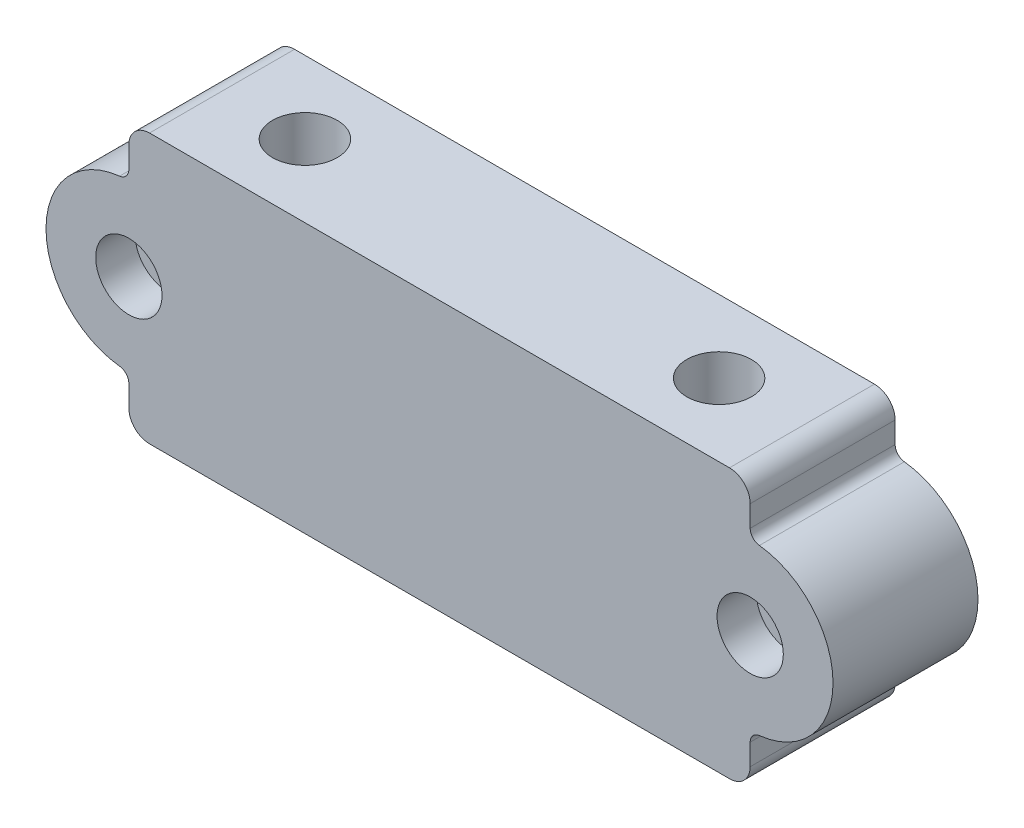
ISO-10303-21;
HEADER;
FILE_DESCRIPTION(('STEP AP214'),'2;1');
FILE_NAME('part.step','',(''),(''),'','','');
FILE_SCHEMA(('AUTOMOTIVE_DESIGN { 1 0 10303 214 1 1 1 1 }'));
ENDSEC;
DATA;
#1=APPLICATION_CONTEXT('core data for automotive mechanical design processes');
#2=APPLICATION_PROTOCOL_DEFINITION('international standard','automotive_design',2000,#1);
#3=PRODUCT_CONTEXT('',#1,'mechanical');
#4=PRODUCT('Part','Part','',(#3));
#5=PRODUCT_RELATED_PRODUCT_CATEGORY('part','',(#4));
#6=PRODUCT_DEFINITION_FORMATION('','',#4);
#7=PRODUCT_DEFINITION_CONTEXT('part definition',#1,'design');
#8=PRODUCT_DEFINITION('design','',#6,#7);
#9=PRODUCT_DEFINITION_SHAPE('','',#8);
#10=(LENGTH_UNIT() NAMED_UNIT(*) SI_UNIT(.MILLI.,.METRE.));
#11=(NAMED_UNIT(*) PLANE_ANGLE_UNIT() SI_UNIT($,.RADIAN.));
#12=(NAMED_UNIT(*) SI_UNIT($,.STERADIAN.) SOLID_ANGLE_UNIT());
#13=UNCERTAINTY_MEASURE_WITH_UNIT(LENGTH_MEASURE(1.E-05),#10,'distance_accuracy_value','');
#14=(GEOMETRIC_REPRESENTATION_CONTEXT(3) GLOBAL_UNCERTAINTY_ASSIGNED_CONTEXT((#13)) GLOBAL_UNIT_ASSIGNED_CONTEXT((#10,
#11,#12)) REPRESENTATION_CONTEXT('',''));
#15=CARTESIAN_POINT('',(0.,0.,0.));
#16=DIRECTION('',(0.,0.,1.));
#17=DIRECTION('',(1.,0.,0.));
#18=AXIS2_PLACEMENT_3D('',#15,#16,#17);
#19=CARTESIAN_POINT('',(101.6,-33.02,0.));
#20=DIRECTION('',(0.,0.,1.));
#21=DIRECTION('',(1.,0.,0.));
#22=AXIS2_PLACEMENT_3D('',#19,#20,#21);
#23=PLANE('',#22);
#24=CARTESIAN_POINT('',(88.9,-16.51,0.));
#25=DIRECTION('',(0.,0.,1.));
#26=DIRECTION('',(1.,0.,0.));
#27=AXIS2_PLACEMENT_3D('',#24,#25,#26);
#28=CIRCLE('',#27,4.064);
#29=CARTESIAN_POINT('',(92.964,-16.51,0.));
#30=VERTEX_POINT('',#29);
#31=EDGE_CURVE('E248',#30,#30,#28,.T.);
#32=ORIENTED_EDGE('',*,*,#31,.F.);
#33=EDGE_LOOP('',(#32));
#34=FACE_BOUND('',#33,.T.);
#35=CARTESIAN_POINT('',(12.7,-16.51,0.));
#36=DIRECTION('',(0.,0.,1.));
#37=DIRECTION('',(1.,0.,0.));
#38=AXIS2_PLACEMENT_3D('',#35,#36,#37);
#39=CIRCLE('',#38,4.064);
#40=CARTESIAN_POINT('',(16.764,-16.51,0.));
#41=VERTEX_POINT('',#40);
#42=EDGE_CURVE('E204',#41,#41,#39,.T.);
#43=ORIENTED_EDGE('',*,*,#42,.F.);
#44=EDGE_LOOP('',(#43));
#45=FACE_BOUND('',#44,.T.);
#46=DIRECTION('',(1.,0.,0.));
#47=VECTOR('',#46,1.);
#48=CARTESIAN_POINT('',(101.6,0.,0.));
#49=LINE('',#48,#47);
#50=CARTESIAN_POINT('',(15.24,0.,0.));
#51=VERTEX_POINT('',#50);
#52=CARTESIAN_POINT('',(86.36,0.,0.));
#53=VERTEX_POINT('',#52);
#54=EDGE_CURVE('E279',#51,#53,#49,.T.);
#55=ORIENTED_EDGE('',*,*,#54,.F.);
#56=CARTESIAN_POINT('',(15.24,-2.54,0.));
#57=DIRECTION('',(0.,0.,1.));
#58=DIRECTION('',(1.,0.,0.));
#59=AXIS2_PLACEMENT_3D('',#56,#57,#58);
#60=CIRCLE('',#59,2.54);
#61=CARTESIAN_POINT('',(12.7,-2.54,0.));
#62=VERTEX_POINT('',#61);
#63=EDGE_CURVE('E301',#51,#62,#60,.T.);
#64=ORIENTED_EDGE('',*,*,#63,.T.);
#65=DIRECTION('',(0.,1.,0.));
#66=VECTOR('',#65,1.);
#67=CARTESIAN_POINT('',(12.7,-5.15077467430091,0.));
#68=LINE('',#67,#66);
#69=CARTESIAN_POINT('',(12.7,-5.15077467430091,0.));
#70=VERTEX_POINT('',#69);
#71=EDGE_CURVE('E195',#70,#62,#68,.T.);
#72=ORIENTED_EDGE('',*,*,#71,.F.);
#73=CARTESIAN_POINT('',(11.43,-5.15077467430094,0.));
#74=DIRECTION('',(0.,0.,1.));
#75=DIRECTION('',(-1.,0.,0.));
#76=AXIS2_PLACEMENT_3D('',#73,#74,#75);
#77=CIRCLE('',#76,1.26999999999998);
#78=CARTESIAN_POINT('',(11.5711111111111,-6.41291082160079,0.));
#79=VERTEX_POINT('',#78);
#80=EDGE_CURVE('E166',#79,#70,#77,.T.);
#81=ORIENTED_EDGE('',*,*,#80,.F.);
#82=CARTESIAN_POINT('',(12.7,-16.5099999999999,0.));
#83=DIRECTION('',(0.,0.,-1.));
#84=DIRECTION('',(-1.,0.,0.));
#85=AXIS2_PLACEMENT_3D('',#82,#83,#84);
#86=CIRCLE('',#85,10.1600000000001);
#87=CARTESIAN_POINT('',(11.5711111111111,-26.607089178399,0.));
#88=VERTEX_POINT('',#87);
#89=EDGE_CURVE('E184',#88,#79,#86,.T.);
#90=ORIENTED_EDGE('',*,*,#89,.F.);
#91=CARTESIAN_POINT('',(11.43,-27.8692253256989,0.));
#92=DIRECTION('',(0.,0.,1.));
#93=DIRECTION('',(1.,0.,0.));
#94=AXIS2_PLACEMENT_3D('',#91,#92,#93);
#95=CIRCLE('',#94,1.27);
#96=CARTESIAN_POINT('',(12.7,-27.8692253256989,0.));
#97=VERTEX_POINT('',#96);
#98=EDGE_CURVE('E187',#97,#88,#95,.T.);
#99=ORIENTED_EDGE('',*,*,#98,.F.);
#100=DIRECTION('',(0.,1.,0.));
#101=VECTOR('',#100,1.);
#102=CARTESIAN_POINT('',(12.7,-27.8692253256989,0.));
#103=LINE('',#102,#101);
#104=CARTESIAN_POINT('',(12.7,-30.48,0.));
#105=VERTEX_POINT('',#104);
#106=EDGE_CURVE('E198',#105,#97,#103,.T.);
#107=ORIENTED_EDGE('',*,*,#106,.F.);
#108=CARTESIAN_POINT('',(15.24,-30.48,0.));
#109=DIRECTION('',(0.,0.,1.));
#110=DIRECTION('',(1.,0.,0.));
#111=AXIS2_PLACEMENT_3D('',#108,#109,#110);
#112=CIRCLE('',#111,2.54);
#113=CARTESIAN_POINT('',(15.24,-33.02,0.));
#114=VERTEX_POINT('',#113);
#115=EDGE_CURVE('E295',#105,#114,#112,.T.);
#116=ORIENTED_EDGE('',*,*,#115,.T.);
#117=DIRECTION('',(1.,0.,0.));
#118=VECTOR('',#117,1.);
#119=CARTESIAN_POINT('',(101.6,-33.02,0.));
#120=LINE('',#119,#118);
#121=CARTESIAN_POINT('',(86.36,-33.02,0.));
#122=VERTEX_POINT('',#121);
#123=EDGE_CURVE('E278',#114,#122,#120,.T.);
#124=ORIENTED_EDGE('',*,*,#123,.T.);
#125=CARTESIAN_POINT('',(86.36,-30.48,0.));
#126=DIRECTION('',(0.,0.,1.));
#127=DIRECTION('',(1.,0.,0.));
#128=AXIS2_PLACEMENT_3D('',#125,#126,#127);
#129=CIRCLE('',#128,2.54);
#130=CARTESIAN_POINT('',(88.9,-30.48,2.66050878019847E-13));
#131=VERTEX_POINT('',#130);
#132=EDGE_CURVE('E297',#122,#131,#129,.T.);
#133=ORIENTED_EDGE('',*,*,#132,.T.);
#134=DIRECTION('',(0.,-1.,0.));
#135=VECTOR('',#134,1.);
#136=CARTESIAN_POINT('',(88.9,-27.8692253256989,2.66050878019847E-13));
#137=LINE('',#136,#135);
#138=CARTESIAN_POINT('',(88.9,-27.8692253256989,2.66050878019847E-13));
#139=VERTEX_POINT('',#138);
#140=EDGE_CURVE('E233',#139,#131,#137,.T.);
#141=ORIENTED_EDGE('',*,*,#140,.F.);
#142=CARTESIAN_POINT('',(90.17,-27.8692253256989,2.74919240620508E-13));
#143=DIRECTION('',(0.,0.,1.));
#144=DIRECTION('',(-1.,0.,0.));
#145=AXIS2_PLACEMENT_3D('',#142,#143,#144);
#146=CIRCLE('',#145,1.27);
#147=CARTESIAN_POINT('',(90.0288888888889,-26.607089178399,2.73933866998212E-13));
#148=VERTEX_POINT('',#147);
#149=EDGE_CURVE('E230',#148,#139,#146,.T.);
#150=ORIENTED_EDGE('',*,*,#149,.F.);
#151=CARTESIAN_POINT('',(88.9,-16.5099999999999,2.66050878019847E-13));
#152=DIRECTION('',(0.,0.,-1.));
#153=DIRECTION('',(1.,0.,0.));
#154=AXIS2_PLACEMENT_3D('',#151,#152,#153);
#155=CIRCLE('',#154,10.1600000000001);
#156=CARTESIAN_POINT('',(90.0288888888889,-6.41291082160078,2.73933866998212E-13));
#157=VERTEX_POINT('',#156);
#158=EDGE_CURVE('E227',#157,#148,#155,.T.);
#159=ORIENTED_EDGE('',*,*,#158,.F.);
#160=CARTESIAN_POINT('',(90.17,-5.15077467430092,2.74919240620508E-13));
#161=DIRECTION('',(0.,0.,1.));
#162=DIRECTION('',(1.,0.,0.));
#163=AXIS2_PLACEMENT_3D('',#160,#161,#162);
#164=CIRCLE('',#163,1.26999999999998);
#165=CARTESIAN_POINT('',(88.9,-5.1507746743009,2.66050878019847E-13));
#166=VERTEX_POINT('',#165);
#167=EDGE_CURVE('E224',#166,#157,#164,.T.);
#168=ORIENTED_EDGE('',*,*,#167,.F.);
#169=DIRECTION('',(0.,-1.,0.));
#170=VECTOR('',#169,1.);
#171=CARTESIAN_POINT('',(88.9,-5.1507746743009,2.66050878019847E-13));
#172=LINE('',#171,#170);
#173=CARTESIAN_POINT('',(88.9,-2.54,2.66050878019847E-13));
#174=VERTEX_POINT('',#173);
#175=EDGE_CURVE('E213',#174,#166,#172,.T.);
#176=ORIENTED_EDGE('',*,*,#175,.F.);
#177=CARTESIAN_POINT('',(86.36,-2.54,0.));
#178=DIRECTION('',(0.,0.,1.));
#179=DIRECTION('',(1.,0.,0.));
#180=AXIS2_PLACEMENT_3D('',#177,#178,#179);
#181=CIRCLE('',#180,2.54);
#182=EDGE_CURVE('E299',#174,#53,#181,.T.);
#183=ORIENTED_EDGE('',*,*,#182,.T.);
#184=EDGE_LOOP('',(#55,#64,#72,#81,#90,#99,#107,#116,#124,#133,#141,#150,#159,#168,#176,#183));
#185=FACE_BOUND('',#184,.T.);
#186=ADVANCED_FACE('F44',(#34,#45,#185),#23,.T.);
#187=CARTESIAN_POINT('',(101.6,-33.02,-17.78));
#188=DIRECTION('',(0.,0.,-1.));
#189=DIRECTION('',(-1.,0.,0.));
#190=AXIS2_PLACEMENT_3D('',#187,#188,#189);
#191=PLANE('',#190);
#192=CARTESIAN_POINT('',(88.9,-16.51,-17.78));
#193=DIRECTION('',(0.,0.,-1.));
#194=DIRECTION('',(-1.,0.,0.));
#195=AXIS2_PLACEMENT_3D('',#192,#193,#194);
#196=CIRCLE('',#195,2.4892);
#197=CARTESIAN_POINT('',(86.4108,-16.51,-17.78));
#198=VERTEX_POINT('',#197);
#199=EDGE_CURVE('E256',#198,#198,#196,.F.);
#200=ORIENTED_EDGE('',*,*,#199,.T.);
#201=EDGE_LOOP('',(#200));
#202=FACE_BOUND('',#201,.T.);
#203=CARTESIAN_POINT('',(12.7,-16.51,-17.78));
#204=DIRECTION('',(0.,0.,-1.));
#205=DIRECTION('',(-1.,0.,0.));
#206=AXIS2_PLACEMENT_3D('',#203,#204,#205);
#207=CIRCLE('',#206,2.4892);
#208=CARTESIAN_POINT('',(10.2108,-16.51,-17.78));
#209=VERTEX_POINT('',#208);
#210=EDGE_CURVE('E260',#209,#209,#207,.F.);
#211=ORIENTED_EDGE('',*,*,#210,.T.);
#212=EDGE_LOOP('',(#211));
#213=FACE_BOUND('',#212,.T.);
#214=DIRECTION('',(0.,1.,0.));
#215=VECTOR('',#214,1.);
#216=CARTESIAN_POINT('',(12.7,-5.15077467430091,-17.78));
#217=LINE('',#216,#215);
#218=CARTESIAN_POINT('',(12.7,-5.15077467430091,-17.78));
#219=VERTEX_POINT('',#218);
#220=CARTESIAN_POINT('',(12.7,-2.54,-17.78));
#221=VERTEX_POINT('',#220);
#222=EDGE_CURVE('E174',#219,#221,#217,.T.);
#223=ORIENTED_EDGE('',*,*,#222,.T.);
#224=CARTESIAN_POINT('',(15.24,-2.54,-17.78));
#225=DIRECTION('',(0.,0.,-1.));
#226=DIRECTION('',(-1.,0.,0.));
#227=AXIS2_PLACEMENT_3D('',#224,#225,#226);
#228=CIRCLE('',#227,2.54);
#229=CARTESIAN_POINT('',(15.24,0.,-17.78));
#230=VERTEX_POINT('',#229);
#231=EDGE_CURVE('E309',#221,#230,#228,.T.);
#232=ORIENTED_EDGE('',*,*,#231,.T.);
#233=DIRECTION('',(-1.,0.,0.));
#234=VECTOR('',#233,1.);
#235=CARTESIAN_POINT('',(101.6,0.,-17.78));
#236=LINE('',#235,#234);
#237=CARTESIAN_POINT('',(86.36,0.,-17.78));
#238=VERTEX_POINT('',#237);
#239=EDGE_CURVE('E273',#238,#230,#236,.T.);
#240=ORIENTED_EDGE('',*,*,#239,.F.);
#241=CARTESIAN_POINT('',(86.36,-2.54,-17.78));
#242=DIRECTION('',(0.,0.,-1.));
#243=DIRECTION('',(-1.,0.,0.));
#244=AXIS2_PLACEMENT_3D('',#241,#242,#243);
#245=CIRCLE('',#244,2.54);
#246=CARTESIAN_POINT('',(88.9,-2.54,-17.7799999999997));
#247=VERTEX_POINT('',#246);
#248=EDGE_CURVE('E307',#238,#247,#245,.T.);
#249=ORIENTED_EDGE('',*,*,#248,.T.);
#250=DIRECTION('',(0.,-1.,0.));
#251=VECTOR('',#250,1.);
#252=CARTESIAN_POINT('',(88.9,-5.1507746743009,-17.7799999999997));
#253=LINE('',#252,#251);
#254=CARTESIAN_POINT('',(88.9,-5.1507746743009,-17.7799999999997));
#255=VERTEX_POINT('',#254);
#256=EDGE_CURVE('E221',#247,#255,#253,.T.);
#257=ORIENTED_EDGE('',*,*,#256,.T.);
#258=CARTESIAN_POINT('',(90.17,-5.15077467430092,-17.7799999999997));
#259=DIRECTION('',(0.,0.,1.));
#260=DIRECTION('',(1.,0.,0.));
#261=AXIS2_PLACEMENT_3D('',#258,#259,#260);
#262=CIRCLE('',#261,1.26999999999998);
#263=CARTESIAN_POINT('',(90.0288888888889,-6.41291082160078,-17.7799999999997));
#264=VERTEX_POINT('',#263);
#265=EDGE_CURVE('E209',#255,#264,#262,.T.);
#266=ORIENTED_EDGE('',*,*,#265,.T.);
#267=CARTESIAN_POINT('',(88.9,-16.5099999999999,-17.7799999999997));
#268=DIRECTION('',(0.,0.,-1.));
#269=DIRECTION('',(1.,0.,0.));
#270=AXIS2_PLACEMENT_3D('',#267,#268,#269);
#271=CIRCLE('',#270,10.1600000000001);
#272=CARTESIAN_POINT('',(90.0288888888889,-26.607089178399,-17.7799999999997));
#273=VERTEX_POINT('',#272);
#274=EDGE_CURVE('E212',#264,#273,#271,.T.);
#275=ORIENTED_EDGE('',*,*,#274,.T.);
#276=CARTESIAN_POINT('',(90.17,-27.8692253256989,-17.7799999999997));
#277=DIRECTION('',(0.,0.,1.));
#278=DIRECTION('',(-1.,0.,0.));
#279=AXIS2_PLACEMENT_3D('',#276,#277,#278);
#280=CIRCLE('',#279,1.27);
#281=CARTESIAN_POINT('',(88.9,-27.8692253256989,-17.7799999999997));
#282=VERTEX_POINT('',#281);
#283=EDGE_CURVE('E216',#273,#282,#280,.T.);
#284=ORIENTED_EDGE('',*,*,#283,.T.);
#285=DIRECTION('',(0.,-1.,0.));
#286=VECTOR('',#285,1.);
#287=CARTESIAN_POINT('',(88.9,-27.8692253256989,-17.7799999999997));
#288=LINE('',#287,#286);
#289=CARTESIAN_POINT('',(88.9,-30.48,-17.7799999999997));
#290=VERTEX_POINT('',#289);
#291=EDGE_CURVE('E219',#282,#290,#288,.T.);
#292=ORIENTED_EDGE('',*,*,#291,.T.);
#293=CARTESIAN_POINT('',(86.36,-30.48,-17.78));
#294=DIRECTION('',(0.,0.,-1.));
#295=DIRECTION('',(-1.,0.,0.));
#296=AXIS2_PLACEMENT_3D('',#293,#294,#295);
#297=CIRCLE('',#296,2.54);
#298=CARTESIAN_POINT('',(86.36,-33.02,-17.78));
#299=VERTEX_POINT('',#298);
#300=EDGE_CURVE('E66',#290,#299,#297,.T.);
#301=ORIENTED_EDGE('',*,*,#300,.T.);
#302=DIRECTION('',(-1.,0.,0.));
#303=VECTOR('',#302,1.);
#304=CARTESIAN_POINT('',(101.6,-33.02,-17.78));
#305=LINE('',#304,#303);
#306=CARTESIAN_POINT('',(15.24,-33.02,-17.78));
#307=VERTEX_POINT('',#306);
#308=EDGE_CURVE('E276',#299,#307,#305,.T.);
#309=ORIENTED_EDGE('',*,*,#308,.T.);
#310=CARTESIAN_POINT('',(15.24,-30.48,-17.78));
#311=DIRECTION('',(0.,0.,-1.));
#312=DIRECTION('',(-1.,0.,0.));
#313=AXIS2_PLACEMENT_3D('',#310,#311,#312);
#314=CIRCLE('',#313,2.54);
#315=CARTESIAN_POINT('',(12.7,-30.48,-17.78));
#316=VERTEX_POINT('',#315);
#317=EDGE_CURVE('E304',#307,#316,#314,.T.);
#318=ORIENTED_EDGE('',*,*,#317,.T.);
#319=DIRECTION('',(0.,1.,0.));
#320=VECTOR('',#319,1.);
#321=CARTESIAN_POINT('',(12.7,-27.8692253256989,-17.78));
#322=LINE('',#321,#320);
#323=CARTESIAN_POINT('',(12.7,-27.8692253256989,-17.78));
#324=VERTEX_POINT('',#323);
#325=EDGE_CURVE('E179',#316,#324,#322,.T.);
#326=ORIENTED_EDGE('',*,*,#325,.T.);
#327=CARTESIAN_POINT('',(11.43,-27.8692253256989,-17.78));
#328=DIRECTION('',(0.,0.,1.));
#329=DIRECTION('',(1.,0.,0.));
#330=AXIS2_PLACEMENT_3D('',#327,#328,#329);
#331=CIRCLE('',#330,1.27);
#332=CARTESIAN_POINT('',(11.5711111111111,-26.607089178399,-17.78));
#333=VERTEX_POINT('',#332);
#334=EDGE_CURVE('E191',#324,#333,#331,.T.);
#335=ORIENTED_EDGE('',*,*,#334,.T.);
#336=CARTESIAN_POINT('',(12.7,-16.5099999999999,-17.78));
#337=DIRECTION('',(0.,0.,-1.));
#338=DIRECTION('',(-1.,0.,0.));
#339=AXIS2_PLACEMENT_3D('',#336,#337,#338);
#340=CIRCLE('',#339,10.1600000000001);
#341=CARTESIAN_POINT('',(11.5711111111111,-6.41291082160079,-17.78));
#342=VERTEX_POINT('',#341);
#343=EDGE_CURVE('E171',#333,#342,#340,.T.);
#344=ORIENTED_EDGE('',*,*,#343,.T.);
#345=CARTESIAN_POINT('',(11.43,-5.15077467430094,-17.78));
#346=DIRECTION('',(0.,0.,1.));
#347=DIRECTION('',(-1.,0.,0.));
#348=AXIS2_PLACEMENT_3D('',#345,#346,#347);
#349=CIRCLE('',#348,1.26999999999998);
#350=EDGE_CURVE('E163',#342,#219,#349,.T.);
#351=ORIENTED_EDGE('',*,*,#350,.T.);
#352=EDGE_LOOP('',(#223,#232,#240,#249,#257,#266,#275,#284,#292,#301,#309,#318,#326,#335,#344,#351));
#353=FACE_BOUND('',#352,.T.);
#354=ADVANCED_FACE('F181',(#202,#213,#353),#191,.T.);
#355=CARTESIAN_POINT('',(12.7,-16.51,-24.8205207989182));
#356=DIRECTION('',(0.,0.,1.));
#357=DIRECTION('',(1.,0.,0.));
#358=AXIS2_PLACEMENT_3D('',#355,#356,#357);
#359=CYLINDRICAL_SURFACE('',#358,2.4892);
#360=ORIENTED_EDGE('',*,*,#210,.F.);
#361=EDGE_LOOP('',(#360));
#362=FACE_BOUND('',#361,.T.);
#363=CARTESIAN_POINT('',(12.7,-16.51,-4.826));
#364=DIRECTION('',(0.,0.,1.));
#365=DIRECTION('',(1.,0.,0.));
#366=AXIS2_PLACEMENT_3D('',#363,#364,#365);
#367=CIRCLE('',#366,2.4892);
#368=CARTESIAN_POINT('',(15.1892,-16.51,-4.826));
#369=VERTEX_POINT('',#368);
#370=EDGE_CURVE('E263',#369,#369,#367,.F.);
#371=ORIENTED_EDGE('',*,*,#370,.F.);
#372=EDGE_LOOP('',(#371));
#373=FACE_BOUND('',#372,.T.);
#374=ADVANCED_FACE('F386',(#362,#373),#359,.F.);
#375=CARTESIAN_POINT('',(88.9,-16.51,-24.8205207989182));
#376=DIRECTION('',(0.,0.,1.));
#377=DIRECTION('',(1.,0.,0.));
#378=AXIS2_PLACEMENT_3D('',#375,#376,#377);
#379=CYLINDRICAL_SURFACE('',#378,2.4892);
#380=ORIENTED_EDGE('',*,*,#199,.F.);
#381=EDGE_LOOP('',(#380));
#382=FACE_BOUND('',#381,.T.);
#383=CARTESIAN_POINT('',(88.9,-16.51,-4.826));
#384=DIRECTION('',(0.,0.,1.));
#385=DIRECTION('',(1.,0.,0.));
#386=AXIS2_PLACEMENT_3D('',#383,#384,#385);
#387=CIRCLE('',#386,2.4892);
#388=CARTESIAN_POINT('',(91.3892,-16.51,-4.826));
#389=VERTEX_POINT('',#388);
#390=EDGE_CURVE('E247',#389,#389,#387,.F.);
#391=ORIENTED_EDGE('',*,*,#390,.F.);
#392=EDGE_LOOP('',(#391));
#393=FACE_BOUND('',#392,.T.);
#394=ADVANCED_FACE('F475',(#382,#393),#379,.F.);
#395=CARTESIAN_POINT('',(0.,-33.02,0.));
#396=DIRECTION('',(0.,-1.,0.));
#397=DIRECTION('',(0.,0.,-1.));
#398=AXIS2_PLACEMENT_3D('',#395,#396,#397);
#399=PLANE('',#398);
#400=ORIENTED_EDGE('',*,*,#308,.F.);
#401=DIRECTION('',(0.,0.,1.));
#402=VECTOR('',#401,1.);
#403=CARTESIAN_POINT('',(86.36,-33.02,2.66050878019847E-13));
#404=LINE('',#403,#402);
#405=EDGE_CURVE('E315',#299,#122,#404,.T.);
#406=ORIENTED_EDGE('',*,*,#405,.T.);
#407=ORIENTED_EDGE('',*,*,#123,.F.);
#408=DIRECTION('',(0.,0.,1.));
#409=VECTOR('',#408,1.);
#410=CARTESIAN_POINT('',(15.24,-33.02,-17.78));
#411=LINE('',#410,#409);
#412=EDGE_CURVE('E59',#114,#307,#411,.F.);
#413=ORIENTED_EDGE('',*,*,#412,.T.);
#414=EDGE_LOOP('',(#400,#406,#407,#413));
#415=FACE_BOUND('',#414,.T.);
#416=CARTESIAN_POINT('',(25.4,-33.02,-8.88999999999997));
#417=DIRECTION('',(0.,1.,0.));
#418=DIRECTION('',(0.,0.,1.));
#419=AXIS2_PLACEMENT_3D('',#416,#417,#418);
#420=CIRCLE('',#419,3.96874999999999);
#421=CARTESIAN_POINT('',(25.4,-33.02,-4.92124999999998));
#422=VERTEX_POINT('',#421);
#423=EDGE_CURVE('E264',#422,#422,#420,.T.);
#424=ORIENTED_EDGE('',*,*,#423,.T.);
#425=EDGE_LOOP('',(#424));
#426=FACE_BOUND('',#425,.T.);
#427=CARTESIAN_POINT('',(76.2,-33.02,-8.88999999999997));
#428=DIRECTION('',(0.,1.,0.));
#429=DIRECTION('',(0.,0.,1.));
#430=AXIS2_PLACEMENT_3D('',#427,#428,#429);
#431=CIRCLE('',#430,3.96875);
#432=CARTESIAN_POINT('',(76.2,-33.02,-4.92124999999997));
#433=VERTEX_POINT('',#432);
#434=EDGE_CURVE('E270',#433,#433,#431,.T.);
#435=ORIENTED_EDGE('',*,*,#434,.T.);
#436=EDGE_LOOP('',(#435));
#437=FACE_BOUND('',#436,.T.);
#438=ADVANCED_FACE('F326',(#415,#426,#437),#399,.T.);
#439=CARTESIAN_POINT('',(0.,0.,0.));
#440=DIRECTION('',(0.,-1.,0.));
#441=DIRECTION('',(0.,0.,-1.));
#442=AXIS2_PLACEMENT_3D('',#439,#440,#441);
#443=PLANE('',#442);
#444=CARTESIAN_POINT('',(25.4,0.,-8.88999999999997));
#445=DIRECTION('',(0.,1.,0.));
#446=DIRECTION('',(0.,0.,1.));
#447=AXIS2_PLACEMENT_3D('',#444,#445,#446);
#448=CIRCLE('',#447,3.96874999999999);
#449=CARTESIAN_POINT('',(25.4,0.,-4.92124999999998));
#450=VERTEX_POINT('',#449);
#451=EDGE_CURVE('E259',#450,#450,#448,.T.);
#452=ORIENTED_EDGE('',*,*,#451,.F.);
#453=EDGE_LOOP('',(#452));
#454=FACE_BOUND('',#453,.T.);
#455=CARTESIAN_POINT('',(76.2,0.,-8.88999999999997));
#456=DIRECTION('',(0.,1.,0.));
#457=DIRECTION('',(0.,0.,1.));
#458=AXIS2_PLACEMENT_3D('',#455,#456,#457);
#459=CIRCLE('',#458,3.96875);
#460=CARTESIAN_POINT('',(76.2,0.,-4.92124999999997));
#461=VERTEX_POINT('',#460);
#462=EDGE_CURVE('E267',#461,#461,#459,.T.);
#463=ORIENTED_EDGE('',*,*,#462,.F.);
#464=EDGE_LOOP('',(#463));
#465=FACE_BOUND('',#464,.T.);
#466=ORIENTED_EDGE('',*,*,#239,.T.);
#467=DIRECTION('',(0.,0.,1.));
#468=VECTOR('',#467,1.);
#469=CARTESIAN_POINT('',(15.24,0.,0.));
#470=LINE('',#469,#468);
#471=EDGE_CURVE('E292',#230,#51,#470,.T.);
#472=ORIENTED_EDGE('',*,*,#471,.T.);
#473=ORIENTED_EDGE('',*,*,#54,.T.);
#474=DIRECTION('',(0.,0.,1.));
#475=VECTOR('',#474,1.);
#476=CARTESIAN_POINT('',(86.36,0.,0.));
#477=LINE('',#476,#475);
#478=EDGE_CURVE('E282',#53,#238,#477,.F.);
#479=ORIENTED_EDGE('',*,*,#478,.T.);
#480=EDGE_LOOP('',(#466,#472,#473,#479));
#481=FACE_BOUND('',#480,.T.);
#482=ADVANCED_FACE('F351',(#454,#465,#481),#443,.F.);
#483=CARTESIAN_POINT('',(76.2,-33.02,-8.88999999999997));
#484=DIRECTION('',(0.,1.,0.));
#485=DIRECTION('',(0.,0.,1.));
#486=AXIS2_PLACEMENT_3D('',#483,#484,#485);
#487=CYLINDRICAL_SURFACE('',#486,3.96875);
#488=ORIENTED_EDGE('',*,*,#434,.F.);
#489=EDGE_LOOP('',(#488));
#490=FACE_BOUND('',#489,.T.);
#491=ORIENTED_EDGE('',*,*,#462,.T.);
#492=EDGE_LOOP('',(#491));
#493=FACE_BOUND('',#492,.T.);
#494=ADVANCED_FACE('F464',(#490,#493),#487,.F.);
#495=CARTESIAN_POINT('',(25.4,-33.02,-8.88999999999997));
#496=DIRECTION('',(0.,1.,0.));
#497=DIRECTION('',(0.,0.,1.));
#498=AXIS2_PLACEMENT_3D('',#495,#496,#497);
#499=CYLINDRICAL_SURFACE('',#498,3.96874999999999);
#500=ORIENTED_EDGE('',*,*,#423,.F.);
#501=EDGE_LOOP('',(#500));
#502=FACE_BOUND('',#501,.T.);
#503=ORIENTED_EDGE('',*,*,#451,.T.);
#504=EDGE_LOOP('',(#503));
#505=FACE_BOUND('',#504,.T.);
#506=ADVANCED_FACE('F563',(#502,#505),#499,.F.);
#507=CARTESIAN_POINT('',(88.9,-16.51,-4.826));
#508=DIRECTION('',(0.,0.,1.));
#509=DIRECTION('',(1.,0.,0.));
#510=AXIS2_PLACEMENT_3D('',#507,#508,#509);
#511=PLANE('',#510);
#512=CARTESIAN_POINT('',(88.9,-16.51,-4.826));
#513=DIRECTION('',(0.,0.,1.));
#514=DIRECTION('',(1.,0.,0.));
#515=AXIS2_PLACEMENT_3D('',#512,#513,#514);
#516=CIRCLE('',#515,4.064);
#517=CARTESIAN_POINT('',(92.964,-16.51,-4.826));
#518=VERTEX_POINT('',#517);
#519=EDGE_CURVE('E244',#518,#518,#516,.T.);
#520=ORIENTED_EDGE('',*,*,#519,.T.);
#521=EDGE_LOOP('',(#520));
#522=FACE_BOUND('',#521,.T.);
#523=ORIENTED_EDGE('',*,*,#390,.T.);
#524=EDGE_LOOP('',(#523));
#525=FACE_BOUND('',#524,.T.);
#526=ADVANCED_FACE('F553',(#522,#525),#511,.T.);
#527=CARTESIAN_POINT('',(88.9,-16.51,-4.826));
#528=DIRECTION('',(0.,0.,1.));
#529=DIRECTION('',(1.,0.,0.));
#530=AXIS2_PLACEMENT_3D('',#527,#528,#529);
#531=CYLINDRICAL_SURFACE('',#530,4.064);
#532=ORIENTED_EDGE('',*,*,#519,.F.);
#533=EDGE_LOOP('',(#532));
#534=FACE_BOUND('',#533,.T.);
#535=ORIENTED_EDGE('',*,*,#31,.T.);
#536=EDGE_LOOP('',(#535));
#537=FACE_BOUND('',#536,.T.);
#538=ADVANCED_FACE('F543',(#534,#537),#531,.F.);
#539=CARTESIAN_POINT('',(12.7,-16.51,-4.826));
#540=DIRECTION('',(0.,0.,1.));
#541=DIRECTION('',(1.,0.,0.));
#542=AXIS2_PLACEMENT_3D('',#539,#540,#541);
#543=PLANE('',#542);
#544=CARTESIAN_POINT('',(12.7,-16.51,-4.826));
#545=DIRECTION('',(0.,0.,1.));
#546=DIRECTION('',(1.,0.,0.));
#547=AXIS2_PLACEMENT_3D('',#544,#545,#546);
#548=CIRCLE('',#547,4.064);
#549=CARTESIAN_POINT('',(16.764,-16.51,-4.826));
#550=VERTEX_POINT('',#549);
#551=EDGE_CURVE('E251',#550,#550,#548,.T.);
#552=ORIENTED_EDGE('',*,*,#551,.T.);
#553=EDGE_LOOP('',(#552));
#554=FACE_BOUND('',#553,.T.);
#555=ORIENTED_EDGE('',*,*,#370,.T.);
#556=EDGE_LOOP('',(#555));
#557=FACE_BOUND('',#556,.T.);
#558=ADVANCED_FACE('F533',(#554,#557),#543,.T.);
#559=CARTESIAN_POINT('',(12.7,-16.51,-4.826));
#560=DIRECTION('',(0.,0.,1.));
#561=DIRECTION('',(1.,0.,0.));
#562=AXIS2_PLACEMENT_3D('',#559,#560,#561);
#563=CYLINDRICAL_SURFACE('',#562,4.064);
#564=ORIENTED_EDGE('',*,*,#551,.F.);
#565=EDGE_LOOP('',(#564));
#566=FACE_BOUND('',#565,.T.);
#567=ORIENTED_EDGE('',*,*,#42,.T.);
#568=EDGE_LOOP('',(#567));
#569=FACE_BOUND('',#568,.T.);
#570=ADVANCED_FACE('F525',(#566,#569),#563,.F.);
#571=CARTESIAN_POINT('',(90.17,-5.15077467430092,-17.7799999999997));
#572=DIRECTION('',(0.,0.,1.));
#573=DIRECTION('',(1.,0.,0.));
#574=AXIS2_PLACEMENT_3D('',#571,#572,#573);
#575=CYLINDRICAL_SURFACE('',#574,1.26999999999998);
#576=ORIENTED_EDGE('',*,*,#167,.T.);
#577=DIRECTION('',(0.,0.,1.));
#578=VECTOR('',#577,1.);
#579=CARTESIAN_POINT('',(90.0288888888889,-6.41291082160078,-17.7799999999997));
#580=LINE('',#579,#578);
#581=EDGE_CURVE('E223',#264,#157,#580,.T.);
#582=ORIENTED_EDGE('',*,*,#581,.F.);
#583=ORIENTED_EDGE('',*,*,#265,.F.);
#584=DIRECTION('',(0.,0.,1.));
#585=VECTOR('',#584,1.);
#586=CARTESIAN_POINT('',(88.9,-5.1507746743009,-17.7799999999997));
#587=LINE('',#586,#585);
#588=EDGE_CURVE('E196',#255,#166,#587,.T.);
#589=ORIENTED_EDGE('',*,*,#588,.T.);
#590=EDGE_LOOP('',(#576,#582,#583,#589));
#591=FACE_BOUND('',#590,.T.);
#592=ADVANCED_FACE('F364',(#591),#575,.F.);
#593=CARTESIAN_POINT('',(88.9,-5.1507746743009,-17.7799999999997));
#594=DIRECTION('',(-1.,0.,0.));
#595=DIRECTION('',(0.,0.,1.));
#596=AXIS2_PLACEMENT_3D('',#593,#594,#595);
#597=PLANE('',#596);
#598=ORIENTED_EDGE('',*,*,#256,.F.);
#599=DIRECTION('',(0.,0.,1.));
#600=VECTOR('',#599,1.);
#601=CARTESIAN_POINT('',(88.9,-2.54,-17.7799999999997));
#602=LINE('',#601,#600);
#603=EDGE_CURVE('E311',#247,#174,#602,.T.);
#604=ORIENTED_EDGE('',*,*,#603,.T.);
#605=ORIENTED_EDGE('',*,*,#175,.T.);
#606=ORIENTED_EDGE('',*,*,#588,.F.);
#607=EDGE_LOOP('',(#598,#604,#605,#606));
#608=FACE_BOUND('',#607,.T.);
#609=ADVANCED_FACE('F359',(#608),#597,.F.);
#610=CARTESIAN_POINT('',(88.9,-27.8692253256989,-17.7799999999997));
#611=DIRECTION('',(-1.,0.,0.));
#612=DIRECTION('',(0.,0.,1.));
#613=AXIS2_PLACEMENT_3D('',#610,#611,#612);
#614=PLANE('',#613);
#615=ORIENTED_EDGE('',*,*,#140,.T.);
#616=DIRECTION('',(0.,0.,1.));
#617=VECTOR('',#616,1.);
#618=CARTESIAN_POINT('',(88.9,-30.48,-17.7799999999997));
#619=LINE('',#618,#617);
#620=EDGE_CURVE('E52',#131,#290,#619,.F.);
#621=ORIENTED_EDGE('',*,*,#620,.T.);
#622=ORIENTED_EDGE('',*,*,#291,.F.);
#623=DIRECTION('',(0.,0.,1.));
#624=VECTOR('',#623,1.);
#625=CARTESIAN_POINT('',(88.9,-27.8692253256989,-17.7799999999997));
#626=LINE('',#625,#624);
#627=EDGE_CURVE('E239',#282,#139,#626,.T.);
#628=ORIENTED_EDGE('',*,*,#627,.T.);
#629=EDGE_LOOP('',(#615,#621,#622,#628));
#630=FACE_BOUND('',#629,.T.);
#631=ADVANCED_FACE('F320',(#630),#614,.F.);
#632=CARTESIAN_POINT('',(90.17,-27.8692253256989,-17.7799999999997));
#633=DIRECTION('',(0.,0.,1.));
#634=DIRECTION('',(1.,0.,0.));
#635=AXIS2_PLACEMENT_3D('',#632,#633,#634);
#636=CYLINDRICAL_SURFACE('',#635,1.27);
#637=ORIENTED_EDGE('',*,*,#149,.T.);
#638=ORIENTED_EDGE('',*,*,#627,.F.);
#639=ORIENTED_EDGE('',*,*,#283,.F.);
#640=DIRECTION('',(0.,0.,1.));
#641=VECTOR('',#640,1.);
#642=CARTESIAN_POINT('',(90.0288888888889,-26.607089178399,-17.7799999999997));
#643=LINE('',#642,#641);
#644=EDGE_CURVE('E241',#273,#148,#643,.T.);
#645=ORIENTED_EDGE('',*,*,#644,.T.);
#646=EDGE_LOOP('',(#637,#638,#639,#645));
#647=FACE_BOUND('',#646,.T.);
#648=ADVANCED_FACE('F371',(#647),#636,.F.);
#649=CARTESIAN_POINT('',(88.9,-16.5099999999999,-17.7799999999997));
#650=DIRECTION('',(0.,0.,1.));
#651=DIRECTION('',(1.,0.,0.));
#652=AXIS2_PLACEMENT_3D('',#649,#650,#651);
#653=CYLINDRICAL_SURFACE('',#652,10.1600000000001);
#654=ORIENTED_EDGE('',*,*,#158,.T.);
#655=ORIENTED_EDGE('',*,*,#644,.F.);
#656=ORIENTED_EDGE('',*,*,#274,.F.);
#657=ORIENTED_EDGE('',*,*,#581,.T.);
#658=EDGE_LOOP('',(#654,#655,#656,#657));
#659=FACE_BOUND('',#658,.T.);
#660=ADVANCED_FACE('F367',(#659),#653,.T.);
#661=CARTESIAN_POINT('',(11.43,-5.15077467430094,-17.78));
#662=DIRECTION('',(0.,0.,1.));
#663=DIRECTION('',(1.,0.,0.));
#664=AXIS2_PLACEMENT_3D('',#661,#662,#663);
#665=CYLINDRICAL_SURFACE('',#664,1.26999999999998);
#666=ORIENTED_EDGE('',*,*,#80,.T.);
#667=DIRECTION('',(0.,0.,1.));
#668=VECTOR('',#667,1.);
#669=CARTESIAN_POINT('',(12.7,-5.15077467430091,-17.78));
#670=LINE('',#669,#668);
#671=EDGE_CURVE('E159',#219,#70,#670,.T.);
#672=ORIENTED_EDGE('',*,*,#671,.F.);
#673=ORIENTED_EDGE('',*,*,#350,.F.);
#674=DIRECTION('',(0.,0.,1.));
#675=VECTOR('',#674,1.);
#676=CARTESIAN_POINT('',(11.5711111111111,-6.41291082160079,-17.78));
#677=LINE('',#676,#675);
#678=EDGE_CURVE('E202',#342,#79,#677,.T.);
#679=ORIENTED_EDGE('',*,*,#678,.T.);
#680=EDGE_LOOP('',(#666,#672,#673,#679));
#681=FACE_BOUND('',#680,.T.);
#682=ADVANCED_FACE('F161',(#681),#665,.F.);
#683=CARTESIAN_POINT('',(12.7,-16.5099999999999,-17.78));
#684=DIRECTION('',(0.,0.,1.));
#685=DIRECTION('',(1.,0.,0.));
#686=AXIS2_PLACEMENT_3D('',#683,#684,#685);
#687=CYLINDRICAL_SURFACE('',#686,10.1600000000001);
#688=ORIENTED_EDGE('',*,*,#89,.T.);
#689=ORIENTED_EDGE('',*,*,#678,.F.);
#690=ORIENTED_EDGE('',*,*,#343,.F.);
#691=DIRECTION('',(0.,0.,1.));
#692=VECTOR('',#691,1.);
#693=CARTESIAN_POINT('',(11.5711111111111,-26.607089178399,-17.78));
#694=LINE('',#693,#692);
#695=EDGE_CURVE('E205',#333,#88,#694,.T.);
#696=ORIENTED_EDGE('',*,*,#695,.T.);
#697=EDGE_LOOP('',(#688,#689,#690,#696));
#698=FACE_BOUND('',#697,.T.);
#699=ADVANCED_FACE('F344',(#698),#687,.T.);
#700=CARTESIAN_POINT('',(11.43,-27.8692253256989,-17.78));
#701=DIRECTION('',(0.,0.,1.));
#702=DIRECTION('',(1.,0.,0.));
#703=AXIS2_PLACEMENT_3D('',#700,#701,#702);
#704=CYLINDRICAL_SURFACE('',#703,1.27);
#705=ORIENTED_EDGE('',*,*,#98,.T.);
#706=ORIENTED_EDGE('',*,*,#695,.F.);
#707=ORIENTED_EDGE('',*,*,#334,.F.);
#708=DIRECTION('',(0.,0.,1.));
#709=VECTOR('',#708,1.);
#710=CARTESIAN_POINT('',(12.7,-27.8692253256989,-17.78));
#711=LINE('',#710,#709);
#712=EDGE_CURVE('E170',#324,#97,#711,.T.);
#713=ORIENTED_EDGE('',*,*,#712,.T.);
#714=EDGE_LOOP('',(#705,#706,#707,#713));
#715=FACE_BOUND('',#714,.T.);
#716=ADVANCED_FACE('F341',(#715),#704,.F.);
#717=CARTESIAN_POINT('',(12.7,-27.8692253256989,-17.78));
#718=DIRECTION('',(1.,0.,0.));
#719=DIRECTION('',(0.,0.,-1.));
#720=AXIS2_PLACEMENT_3D('',#717,#718,#719);
#721=PLANE('',#720);
#722=ORIENTED_EDGE('',*,*,#325,.F.);
#723=DIRECTION('',(0.,0.,1.));
#724=VECTOR('',#723,1.);
#725=CARTESIAN_POINT('',(12.7,-30.48,0.));
#726=LINE('',#725,#724);
#727=EDGE_CURVE('E11',#316,#105,#726,.T.);
#728=ORIENTED_EDGE('',*,*,#727,.T.);
#729=ORIENTED_EDGE('',*,*,#106,.T.);
#730=ORIENTED_EDGE('',*,*,#712,.F.);
#731=EDGE_LOOP('',(#722,#728,#729,#730));
#732=FACE_BOUND('',#731,.T.);
#733=ADVANCED_FACE('F337',(#732),#721,.F.);
#734=CARTESIAN_POINT('',(12.7,-5.15077467430091,-17.78));
#735=DIRECTION('',(1.,0.,0.));
#736=DIRECTION('',(0.,0.,-1.));
#737=AXIS2_PLACEMENT_3D('',#734,#735,#736);
#738=PLANE('',#737);
#739=ORIENTED_EDGE('',*,*,#71,.T.);
#740=DIRECTION('',(0.,0.,1.));
#741=VECTOR('',#740,1.);
#742=CARTESIAN_POINT('',(12.7,-2.54,-17.78));
#743=LINE('',#742,#741);
#744=EDGE_CURVE('E177',#62,#221,#743,.F.);
#745=ORIENTED_EDGE('',*,*,#744,.T.);
#746=ORIENTED_EDGE('',*,*,#222,.F.);
#747=ORIENTED_EDGE('',*,*,#671,.T.);
#748=EDGE_LOOP('',(#739,#745,#746,#747));
#749=FACE_BOUND('',#748,.T.);
#750=ADVANCED_FACE('F175',(#749),#738,.F.);
#751=CARTESIAN_POINT('',(15.24,-2.54,0.));
#752=DIRECTION('',(0.,0.,1.));
#753=DIRECTION('',(1.,0.,0.));
#754=AXIS2_PLACEMENT_3D('',#751,#752,#753);
#755=CYLINDRICAL_SURFACE('',#754,2.54);
#756=ORIENTED_EDGE('',*,*,#231,.F.);
#757=ORIENTED_EDGE('',*,*,#744,.F.);
#758=ORIENTED_EDGE('',*,*,#63,.F.);
#759=ORIENTED_EDGE('',*,*,#471,.F.);
#760=EDGE_LOOP('',(#756,#757,#758,#759));
#761=FACE_BOUND('',#760,.T.);
#762=ADVANCED_FACE('F346',(#761),#755,.T.);
#763=CARTESIAN_POINT('',(86.36,-2.54,-17.7799999999997));
#764=DIRECTION('',(0.,0.,1.));
#765=DIRECTION('',(1.,0.,0.));
#766=AXIS2_PLACEMENT_3D('',#763,#764,#765);
#767=CYLINDRICAL_SURFACE('',#766,2.54);
#768=ORIENTED_EDGE('',*,*,#248,.F.);
#769=ORIENTED_EDGE('',*,*,#478,.F.);
#770=ORIENTED_EDGE('',*,*,#182,.F.);
#771=ORIENTED_EDGE('',*,*,#603,.F.);
#772=EDGE_LOOP('',(#768,#769,#770,#771));
#773=FACE_BOUND('',#772,.T.);
#774=ADVANCED_FACE('F354',(#773),#767,.T.);
#775=CARTESIAN_POINT('',(86.36,-30.48,0.));
#776=DIRECTION('',(0.,0.,-1.));
#777=DIRECTION('',(-1.,0.,0.));
#778=AXIS2_PLACEMENT_3D('',#775,#776,#777);
#779=CYLINDRICAL_SURFACE('',#778,2.54);
#780=ORIENTED_EDGE('',*,*,#300,.F.);
#781=ORIENTED_EDGE('',*,*,#620,.F.);
#782=ORIENTED_EDGE('',*,*,#132,.F.);
#783=ORIENTED_EDGE('',*,*,#405,.F.);
#784=EDGE_LOOP('',(#780,#781,#782,#783));
#785=FACE_BOUND('',#784,.T.);
#786=ADVANCED_FACE('F325',(#785),#779,.T.);
#787=CARTESIAN_POINT('',(15.24,-30.48,-17.78));
#788=DIRECTION('',(0.,0.,-1.));
#789=DIRECTION('',(-1.,0.,0.));
#790=AXIS2_PLACEMENT_3D('',#787,#788,#789);
#791=CYLINDRICAL_SURFACE('',#790,2.54);
#792=ORIENTED_EDGE('',*,*,#317,.F.);
#793=ORIENTED_EDGE('',*,*,#412,.F.);
#794=ORIENTED_EDGE('',*,*,#115,.F.);
#795=ORIENTED_EDGE('',*,*,#727,.F.);
#796=EDGE_LOOP('',(#792,#793,#794,#795));
#797=FACE_BOUND('',#796,.T.);
#798=ADVANCED_FACE('F46',(#797),#791,.T.);
#799=CLOSED_SHELL('',(#186,#354,#374,#394,#438,#482,#494,#506,#526,#538,#558,#570,#592,#609,
#631,#648,#660,#682,#699,#716,#733,#750,#762,#774,#786,#798));
#800=MANIFOLD_SOLID_BREP('B2',#799);
#801=ADVANCED_BREP_SHAPE_REPRESENTATION('',(#18,#800),#14);
#802=SHAPE_DEFINITION_REPRESENTATION(#9,#801);
ENDSEC;
END-ISO-10303-21;
